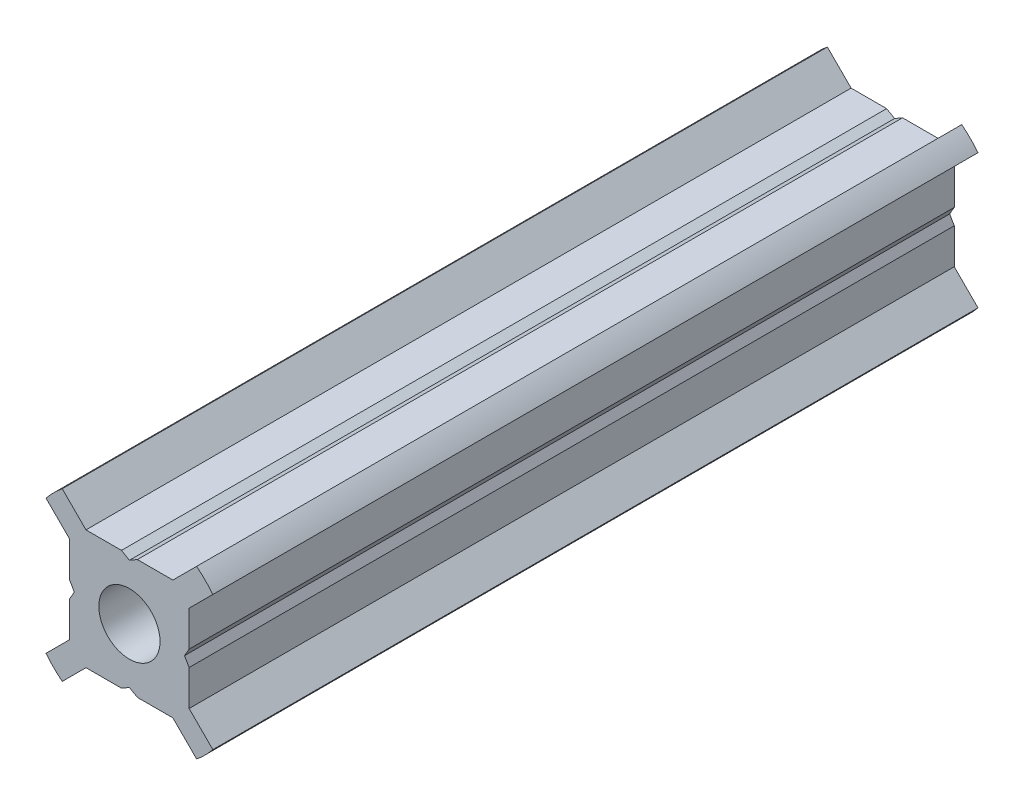
ISO-10303-21;
HEADER;
FILE_DESCRIPTION(('STEP AP214'),'2;1');
FILE_NAME('part.step','',(''),(''),'','','');
FILE_SCHEMA(('AUTOMOTIVE_DESIGN { 1 0 10303 214 1 1 1 1 }'));
ENDSEC;
DATA;
#1=APPLICATION_CONTEXT('core data for automotive mechanical design processes');
#2=APPLICATION_PROTOCOL_DEFINITION('international standard','automotive_design',2000,#1);
#3=PRODUCT_CONTEXT('',#1,'mechanical');
#4=PRODUCT('Part','Part','',(#3));
#5=PRODUCT_RELATED_PRODUCT_CATEGORY('part','',(#4));
#6=PRODUCT_DEFINITION_FORMATION('','',#4);
#7=PRODUCT_DEFINITION_CONTEXT('part definition',#1,'design');
#8=PRODUCT_DEFINITION('design','',#6,#7);
#9=PRODUCT_DEFINITION_SHAPE('','',#8);
#10=(LENGTH_UNIT() NAMED_UNIT(*) SI_UNIT(.MILLI.,.METRE.));
#11=(NAMED_UNIT(*) PLANE_ANGLE_UNIT() SI_UNIT($,.RADIAN.));
#12=(NAMED_UNIT(*) SI_UNIT($,.STERADIAN.) SOLID_ANGLE_UNIT());
#13=UNCERTAINTY_MEASURE_WITH_UNIT(LENGTH_MEASURE(1.E-05),#10,'distance_accuracy_value','');
#14=(GEOMETRIC_REPRESENTATION_CONTEXT(3) GLOBAL_UNCERTAINTY_ASSIGNED_CONTEXT((#13)) GLOBAL_UNIT_ASSIGNED_CONTEXT((#10,
#11,#12)) REPRESENTATION_CONTEXT('',''));
#15=CARTESIAN_POINT('',(0.,0.,0.));
#16=DIRECTION('',(0.,0.,1.));
#17=DIRECTION('',(1.,0.,0.));
#18=AXIS2_PLACEMENT_3D('',#15,#16,#17);
#19=CARTESIAN_POINT('',(0.530330085889972,-0.530330085889958,50.));
#20=DIRECTION('',(0.707106781186557,-0.707106781186538,0.));
#21=DIRECTION('',(0.707106781186538,0.707106781186557,0.));
#22=AXIS2_PLACEMENT_3D('',#19,#20,#21);
#23=PLANE('',#22);
#24=DIRECTION('',(-0.707106781186538,-0.707106781186557,0.));
#25=VECTOR('',#24,1.);
#26=CARTESIAN_POINT('',(0.530330085889972,-0.530330085889958,0.));
#27=LINE('',#26,#25);
#28=CARTESIAN_POINT('',(5.45158500714728,4.39092483536748,0.));
#29=VERTEX_POINT('',#28);
#30=CARTESIAN_POINT('',(3.89999999999985,2.83933982822001,0.));
#31=VERTEX_POINT('',#30);
#32=EDGE_CURVE('E270',#29,#31,#27,.T.);
#33=ORIENTED_EDGE('',*,*,#32,.F.);
#34=DIRECTION('',(0.,0.,-1.));
#35=VECTOR('',#34,1.);
#36=CARTESIAN_POINT('',(5.45158500714728,4.39092483536748,50.));
#37=LINE('',#36,#35);
#38=CARTESIAN_POINT('',(5.45158500714728,4.39092483536748,50.));
#39=VERTEX_POINT('',#38);
#40=EDGE_CURVE('E11',#39,#29,#37,.T.);
#41=ORIENTED_EDGE('',*,*,#40,.F.);
#42=DIRECTION('',(-0.707106781186538,-0.707106781186557,0.));
#43=VECTOR('',#42,1.);
#44=CARTESIAN_POINT('',(0.530330085889972,-0.530330085889958,50.));
#45=LINE('',#44,#43);
#46=CARTESIAN_POINT('',(3.89999999999985,2.83933982822001,50.));
#47=VERTEX_POINT('',#46);
#48=EDGE_CURVE('E571',#39,#47,#45,.T.);
#49=ORIENTED_EDGE('',*,*,#48,.T.);
#50=DIRECTION('',(0.,0.,-1.));
#51=VECTOR('',#50,1.);
#52=CARTESIAN_POINT('',(3.89999999999985,2.83933982822001,50.));
#53=LINE('',#52,#51);
#54=EDGE_CURVE('E159',#47,#31,#53,.T.);
#55=ORIENTED_EDGE('',*,*,#54,.T.);
#56=EDGE_LOOP('',(#33,#41,#49,#55));
#57=FACE_BOUND('',#56,.T.);
#58=ADVANCED_FACE('F47',(#57),#23,.T.);
#59=CARTESIAN_POINT('',(0.,0.,50.));
#60=DIRECTION('',(0.,0.,-1.));
#61=DIRECTION('',(-1.,0.,0.));
#62=AXIS2_PLACEMENT_3D('',#59,#60,#61);
#63=CYLINDRICAL_SURFACE('',#62,7.);
#64=CARTESIAN_POINT('',(0.,0.,0.));
#65=DIRECTION('',(0.,0.,1.));
#66=DIRECTION('',(1.,0.,0.));
#67=AXIS2_PLACEMENT_3D('',#64,#65,#66);
#68=CIRCLE('',#67,7.);
#69=CARTESIAN_POINT('',(4.39092483536735,5.45158500714739,0.));
#70=VERTEX_POINT('',#69);
#71=EDGE_CURVE('E274',#29,#70,#68,.T.);
#72=ORIENTED_EDGE('',*,*,#71,.T.);
#73=DIRECTION('',(0.,0.,-1.));
#74=VECTOR('',#73,1.);
#75=CARTESIAN_POINT('',(4.39092483536735,5.45158500714739,50.));
#76=LINE('',#75,#74);
#77=CARTESIAN_POINT('',(4.39092483536735,5.45158500714739,50.));
#78=VERTEX_POINT('',#77);
#79=EDGE_CURVE('E57',#78,#70,#76,.T.);
#80=ORIENTED_EDGE('',*,*,#79,.F.);
#81=CARTESIAN_POINT('',(0.,0.,50.));
#82=DIRECTION('',(0.,0.,1.));
#83=DIRECTION('',(1.,0.,0.));
#84=AXIS2_PLACEMENT_3D('',#81,#82,#83);
#85=CIRCLE('',#84,7.);
#86=EDGE_CURVE('E574',#39,#78,#85,.T.);
#87=ORIENTED_EDGE('',*,*,#86,.F.);
#88=ORIENTED_EDGE('',*,*,#40,.T.);
#89=EDGE_LOOP('',(#72,#80,#87,#88));
#90=FACE_BOUND('',#89,.T.);
#91=ADVANCED_FACE('F461',(#90),#63,.T.);
#92=CARTESIAN_POINT('',(-0.530330085890019,0.530330085890019,50.));
#93=DIRECTION('',(0.707106781186547,-0.707106781186548,0.));
#94=DIRECTION('',(0.707106781186548,0.707106781186547,0.));
#95=AXIS2_PLACEMENT_3D('',#92,#93,#94);
#96=PLANE('',#95);
#97=DIRECTION('',(-0.707106781186548,-0.707106781186547,0.));
#98=VECTOR('',#97,1.);
#99=CARTESIAN_POINT('',(-0.530330085890019,0.530330085890019,0.));
#100=LINE('',#99,#98);
#101=CARTESIAN_POINT('',(2.83933982821991,3.89999999999995,0.));
#102=VERTEX_POINT('',#101);
#103=EDGE_CURVE('E278',#70,#102,#100,.T.);
#104=ORIENTED_EDGE('',*,*,#103,.T.);
#105=DIRECTION('',(0.,0.,-1.));
#106=VECTOR('',#105,1.);
#107=CARTESIAN_POINT('',(2.83933982821991,3.89999999999995,50.));
#108=LINE('',#107,#106);
#109=CARTESIAN_POINT('',(2.83933982821991,3.89999999999995,50.));
#110=VERTEX_POINT('',#109);
#111=EDGE_CURVE('E447',#110,#102,#108,.T.);
#112=ORIENTED_EDGE('',*,*,#111,.F.);
#113=DIRECTION('',(-0.707106781186548,-0.707106781186547,0.));
#114=VECTOR('',#113,1.);
#115=CARTESIAN_POINT('',(-0.530330085890019,0.530330085890019,50.));
#116=LINE('',#115,#114);
#117=EDGE_CURVE('E457',#78,#110,#116,.T.);
#118=ORIENTED_EDGE('',*,*,#117,.F.);
#119=ORIENTED_EDGE('',*,*,#79,.T.);
#120=EDGE_LOOP('',(#104,#112,#118,#119));
#121=FACE_BOUND('',#120,.T.);
#122=ADVANCED_FACE('F454',(#121),#96,.F.);
#123=CARTESIAN_POINT('',(0.,3.89999999999995,50.));
#124=DIRECTION('',(0.,-1.,0.));
#125=DIRECTION('',(0.,0.,-1.));
#126=AXIS2_PLACEMENT_3D('',#123,#124,#125);
#127=PLANE('',#126);
#128=DIRECTION('',(-1.,0.,0.));
#129=VECTOR('',#128,1.);
#130=CARTESIAN_POINT('',(0.,3.89999999999995,0.));
#131=LINE('',#130,#129);
#132=CARTESIAN_POINT('',(0.519615242270402,3.89999999999995,0.));
#133=VERTEX_POINT('',#132);
#134=EDGE_CURVE('E284',#102,#133,#131,.T.);
#135=ORIENTED_EDGE('',*,*,#134,.T.);
#136=DIRECTION('',(0.,0.,-1.));
#137=VECTOR('',#136,1.);
#138=CARTESIAN_POINT('',(0.519615242270402,3.89999999999995,50.));
#139=LINE('',#138,#137);
#140=CARTESIAN_POINT('',(0.519615242270402,3.89999999999995,50.));
#141=VERTEX_POINT('',#140);
#142=EDGE_CURVE('E443',#141,#133,#139,.T.);
#143=ORIENTED_EDGE('',*,*,#142,.F.);
#144=DIRECTION('',(-1.,0.,0.));
#145=VECTOR('',#144,1.);
#146=CARTESIAN_POINT('',(0.,3.89999999999995,50.));
#147=LINE('',#146,#145);
#148=EDGE_CURVE('E583',#110,#141,#147,.T.);
#149=ORIENTED_EDGE('',*,*,#148,.F.);
#150=ORIENTED_EDGE('',*,*,#111,.T.);
#151=EDGE_LOOP('',(#135,#143,#149,#150));
#152=FACE_BOUND('',#151,.T.);
#153=ADVANCED_FACE('F474',(#152),#127,.F.);
#154=CARTESIAN_POINT('',(-1.55884572681257,2.69999999999878,50.));
#155=DIRECTION('',(0.500000000000309,-0.86602540378426,0.));
#156=DIRECTION('',(0.866025403784261,0.500000000000309,0.));
#157=AXIS2_PLACEMENT_3D('',#154,#155,#156);
#158=PLANE('',#157);
#159=DIRECTION('',(-0.866025403784261,-0.500000000000309,0.));
#160=VECTOR('',#159,1.);
#161=CARTESIAN_POINT('',(-1.55884572681257,2.69999999999878,0.));
#162=LINE('',#161,#160);
#163=CARTESIAN_POINT('',(0.,3.59999999999985,0.));
#164=VERTEX_POINT('',#163);
#165=EDGE_CURVE('E288',#133,#164,#162,.T.);
#166=ORIENTED_EDGE('',*,*,#165,.T.);
#167=DIRECTION('',(0.,0.,-1.));
#168=VECTOR('',#167,1.);
#169=CARTESIAN_POINT('',(0.,3.59999999999985,50.));
#170=LINE('',#169,#168);
#171=CARTESIAN_POINT('',(0.,3.59999999999985,50.));
#172=VERTEX_POINT('',#171);
#173=EDGE_CURVE('E440',#172,#164,#170,.T.);
#174=ORIENTED_EDGE('',*,*,#173,.F.);
#175=DIRECTION('',(-0.866025403784261,-0.500000000000309,0.));
#176=VECTOR('',#175,1.);
#177=CARTESIAN_POINT('',(-1.55884572681257,2.69999999999878,50.));
#178=LINE('',#177,#176);
#179=EDGE_CURVE('E587',#141,#172,#178,.T.);
#180=ORIENTED_EDGE('',*,*,#179,.F.);
#181=ORIENTED_EDGE('',*,*,#142,.T.);
#182=EDGE_LOOP('',(#166,#174,#180,#181));
#183=FACE_BOUND('',#182,.T.);
#184=ADVANCED_FACE('F477',(#183),#158,.F.);
#185=CARTESIAN_POINT('',(1.55884572681257,2.69999999999878,50.));
#186=DIRECTION('',(0.500000000000309,0.86602540378426,0.));
#187=DIRECTION('',(-0.866025403784261,0.500000000000309,0.));
#188=AXIS2_PLACEMENT_3D('',#185,#186,#187);
#189=PLANE('',#188);
#190=DIRECTION('',(0.866025403784261,-0.500000000000309,0.));
#191=VECTOR('',#190,1.);
#192=CARTESIAN_POINT('',(1.55884572681257,2.69999999999878,0.));
#193=LINE('',#192,#191);
#194=CARTESIAN_POINT('',(-0.519615242270402,3.89999999999995,0.));
#195=VERTEX_POINT('',#194);
#196=EDGE_CURVE('E292',#195,#164,#193,.T.);
#197=ORIENTED_EDGE('',*,*,#196,.F.);
#198=DIRECTION('',(0.,0.,-1.));
#199=VECTOR('',#198,1.);
#200=CARTESIAN_POINT('',(-0.519615242270402,3.89999999999995,50.));
#201=LINE('',#200,#199);
#202=CARTESIAN_POINT('',(-0.519615242270402,3.89999999999995,50.));
#203=VERTEX_POINT('',#202);
#204=EDGE_CURVE('E437',#203,#195,#201,.T.);
#205=ORIENTED_EDGE('',*,*,#204,.F.);
#206=DIRECTION('',(0.866025403784261,-0.500000000000309,0.));
#207=VECTOR('',#206,1.);
#208=CARTESIAN_POINT('',(1.55884572681257,2.69999999999878,50.));
#209=LINE('',#208,#207);
#210=EDGE_CURVE('E590',#203,#172,#209,.T.);
#211=ORIENTED_EDGE('',*,*,#210,.T.);
#212=ORIENTED_EDGE('',*,*,#173,.T.);
#213=EDGE_LOOP('',(#197,#205,#211,#212));
#214=FACE_BOUND('',#213,.T.);
#215=ADVANCED_FACE('F481',(#214),#189,.T.);
#216=CARTESIAN_POINT('',(0.,3.89999999999995,50.));
#217=DIRECTION('',(0.,1.,0.));
#218=DIRECTION('',(0.,0.,1.));
#219=AXIS2_PLACEMENT_3D('',#216,#217,#218);
#220=PLANE('',#219);
#221=DIRECTION('',(1.,0.,0.));
#222=VECTOR('',#221,1.);
#223=CARTESIAN_POINT('',(0.,3.89999999999995,0.));
#224=LINE('',#223,#222);
#225=CARTESIAN_POINT('',(-2.83933982821991,3.89999999999995,0.));
#226=VERTEX_POINT('',#225);
#227=EDGE_CURVE('E296',#226,#195,#224,.T.);
#228=ORIENTED_EDGE('',*,*,#227,.F.);
#229=DIRECTION('',(0.,0.,-1.));
#230=VECTOR('',#229,1.);
#231=CARTESIAN_POINT('',(-2.83933982821991,3.89999999999995,50.));
#232=LINE('',#231,#230);
#233=CARTESIAN_POINT('',(-2.83933982821991,3.89999999999995,50.));
#234=VERTEX_POINT('',#233);
#235=EDGE_CURVE('E434',#234,#226,#232,.T.);
#236=ORIENTED_EDGE('',*,*,#235,.F.);
#237=DIRECTION('',(1.,0.,0.));
#238=VECTOR('',#237,1.);
#239=CARTESIAN_POINT('',(0.,3.89999999999995,50.));
#240=LINE('',#239,#238);
#241=EDGE_CURVE('E594',#234,#203,#240,.T.);
#242=ORIENTED_EDGE('',*,*,#241,.T.);
#243=ORIENTED_EDGE('',*,*,#204,.T.);
#244=EDGE_LOOP('',(#228,#236,#242,#243));
#245=FACE_BOUND('',#244,.T.);
#246=ADVANCED_FACE('F485',(#245),#220,.T.);
#247=CARTESIAN_POINT('',(0.530330085890019,0.530330085890019,50.));
#248=DIRECTION('',(0.707106781186547,0.707106781186548,0.));
#249=DIRECTION('',(-0.707106781186548,0.707106781186547,0.));
#250=AXIS2_PLACEMENT_3D('',#247,#248,#249);
#251=PLANE('',#250);
#252=DIRECTION('',(0.707106781186548,-0.707106781186547,0.));
#253=VECTOR('',#252,1.);
#254=CARTESIAN_POINT('',(0.530330085890019,0.530330085890019,0.));
#255=LINE('',#254,#253);
#256=CARTESIAN_POINT('',(-4.39092483536735,5.45158500714739,0.));
#257=VERTEX_POINT('',#256);
#258=EDGE_CURVE('E300',#257,#226,#255,.T.);
#259=ORIENTED_EDGE('',*,*,#258,.F.);
#260=DIRECTION('',(0.,0.,-1.));
#261=VECTOR('',#260,1.);
#262=CARTESIAN_POINT('',(-4.39092483536735,5.45158500714739,50.));
#263=LINE('',#262,#261);
#264=CARTESIAN_POINT('',(-4.39092483536735,5.45158500714739,50.));
#265=VERTEX_POINT('',#264);
#266=EDGE_CURVE('E431',#265,#257,#263,.T.);
#267=ORIENTED_EDGE('',*,*,#266,.F.);
#268=DIRECTION('',(0.707106781186548,-0.707106781186547,0.));
#269=VECTOR('',#268,1.);
#270=CARTESIAN_POINT('',(0.530330085890019,0.530330085890019,50.));
#271=LINE('',#270,#269);
#272=EDGE_CURVE('E598',#265,#234,#271,.T.);
#273=ORIENTED_EDGE('',*,*,#272,.T.);
#274=ORIENTED_EDGE('',*,*,#235,.T.);
#275=EDGE_LOOP('',(#259,#267,#273,#274));
#276=FACE_BOUND('',#275,.T.);
#277=ADVANCED_FACE('F489',(#276),#251,.T.);
#278=CARTESIAN_POINT('',(-5.4515850071473,4.39092483536746,0.));
#279=VERTEX_POINT('',#278);
#280=EDGE_CURVE('E280',#257,#279,#68,.T.);
#281=ORIENTED_EDGE('',*,*,#280,.T.);
#282=DIRECTION('',(0.,0.,-1.));
#283=VECTOR('',#282,1.);
#284=CARTESIAN_POINT('',(-5.4515850071473,4.39092483536746,50.));
#285=LINE('',#284,#283);
#286=CARTESIAN_POINT('',(-5.4515850071473,4.39092483536746,50.));
#287=VERTEX_POINT('',#286);
#288=EDGE_CURVE('E427',#287,#279,#285,.T.);
#289=ORIENTED_EDGE('',*,*,#288,.F.);
#290=EDGE_CURVE('E580',#265,#287,#85,.T.);
#291=ORIENTED_EDGE('',*,*,#290,.F.);
#292=ORIENTED_EDGE('',*,*,#266,.T.);
#293=EDGE_LOOP('',(#281,#289,#291,#292));
#294=FACE_BOUND('',#293,.T.);
#295=ADVANCED_FACE('F469',(#294),#63,.T.);
#296=CARTESIAN_POINT('',(-0.530330085889926,-0.530330085889924,50.));
#297=DIRECTION('',(0.707106781186549,0.707106781186546,0.));
#298=DIRECTION('',(-0.707106781186546,0.707106781186549,0.));
#299=AXIS2_PLACEMENT_3D('',#296,#297,#298);
#300=PLANE('',#299);
#301=DIRECTION('',(0.707106781186546,-0.707106781186549,0.));
#302=VECTOR('',#301,1.);
#303=CARTESIAN_POINT('',(-0.530330085889926,-0.530330085889924,0.));
#304=LINE('',#303,#302);
#305=CARTESIAN_POINT('',(-3.89999999999985,2.83933982822001,0.));
#306=VERTEX_POINT('',#305);
#307=EDGE_CURVE('E304',#279,#306,#304,.T.);
#308=ORIENTED_EDGE('',*,*,#307,.T.);
#309=DIRECTION('',(0.,0.,-1.));
#310=VECTOR('',#309,1.);
#311=CARTESIAN_POINT('',(-3.89999999999985,2.83933982822001,50.));
#312=LINE('',#311,#310);
#313=CARTESIAN_POINT('',(-3.89999999999985,2.83933982822001,50.));
#314=VERTEX_POINT('',#313);
#315=EDGE_CURVE('E424',#314,#306,#312,.T.);
#316=ORIENTED_EDGE('',*,*,#315,.F.);
#317=DIRECTION('',(0.707106781186546,-0.707106781186549,0.));
#318=VECTOR('',#317,1.);
#319=CARTESIAN_POINT('',(-0.530330085889926,-0.530330085889924,50.));
#320=LINE('',#319,#318);
#321=EDGE_CURVE('E602',#287,#314,#320,.T.);
#322=ORIENTED_EDGE('',*,*,#321,.F.);
#323=ORIENTED_EDGE('',*,*,#288,.T.);
#324=EDGE_LOOP('',(#308,#316,#322,#323));
#325=FACE_BOUND('',#324,.T.);
#326=ADVANCED_FACE('F494',(#325),#300,.F.);
#327=CARTESIAN_POINT('',(-3.89999999999986,0.,50.));
#328=DIRECTION('',(-1.,0.,0.));
#329=DIRECTION('',(0.,-1.,0.));
#330=AXIS2_PLACEMENT_3D('',#327,#328,#329);
#331=PLANE('',#330);
#332=DIRECTION('',(0.,1.,0.));
#333=VECTOR('',#332,1.);
#334=CARTESIAN_POINT('',(-3.89999999999986,0.,0.));
#335=LINE('',#334,#333);
#336=CARTESIAN_POINT('',(-3.89999999999986,0.519615242270506,0.));
#337=VERTEX_POINT('',#336);
#338=EDGE_CURVE('E308',#337,#306,#335,.T.);
#339=ORIENTED_EDGE('',*,*,#338,.F.);
#340=DIRECTION('',(0.,0.,-1.));
#341=VECTOR('',#340,1.);
#342=CARTESIAN_POINT('',(-3.89999999999986,0.519615242270506,50.));
#343=LINE('',#342,#341);
#344=CARTESIAN_POINT('',(-3.89999999999986,0.519615242270506,50.));
#345=VERTEX_POINT('',#344);
#346=EDGE_CURVE('E421',#345,#337,#343,.T.);
#347=ORIENTED_EDGE('',*,*,#346,.F.);
#348=DIRECTION('',(0.,1.,0.));
#349=VECTOR('',#348,1.);
#350=CARTESIAN_POINT('',(-3.89999999999986,0.,50.));
#351=LINE('',#350,#349);
#352=EDGE_CURVE('E605',#345,#314,#351,.T.);
#353=ORIENTED_EDGE('',*,*,#352,.T.);
#354=ORIENTED_EDGE('',*,*,#315,.T.);
#355=EDGE_LOOP('',(#339,#347,#353,#354));
#356=FACE_BOUND('',#355,.T.);
#357=ADVANCED_FACE('F497',(#356),#331,.T.);
#358=CARTESIAN_POINT('',(-2.69999999999997,-1.55884572681197,50.));
#359=DIRECTION('',(0.866025403784439,0.499999999999999,0.));
#360=DIRECTION('',(-0.499999999999999,0.866025403784439,0.));
#361=AXIS2_PLACEMENT_3D('',#358,#359,#360);
#362=PLANE('',#361);
#363=DIRECTION('',(0.499999999999999,-0.866025403784439,0.));
#364=VECTOR('',#363,1.);
#365=CARTESIAN_POINT('',(-2.69999999999997,-1.55884572681197,0.));
#366=LINE('',#365,#364);
#367=CARTESIAN_POINT('',(-3.59999999999986,-1.60895602396849E-13,0.));
#368=VERTEX_POINT('',#367);
#369=EDGE_CURVE('E312',#337,#368,#366,.T.);
#370=ORIENTED_EDGE('',*,*,#369,.T.);
#371=DIRECTION('',(0.,0.,-1.));
#372=VECTOR('',#371,1.);
#373=CARTESIAN_POINT('',(-3.59999999999986,-1.60895602396849E-13,50.));
#374=LINE('',#373,#372);
#375=CARTESIAN_POINT('',(-3.59999999999986,-1.60895602396849E-13,50.));
#376=VERTEX_POINT('',#375);
#377=EDGE_CURVE('E417',#376,#368,#374,.T.);
#378=ORIENTED_EDGE('',*,*,#377,.F.);
#379=DIRECTION('',(0.499999999999999,-0.866025403784439,0.));
#380=VECTOR('',#379,1.);
#381=CARTESIAN_POINT('',(-2.69999999999997,-1.55884572681197,50.));
#382=LINE('',#381,#380);
#383=EDGE_CURVE('E609',#345,#376,#382,.T.);
#384=ORIENTED_EDGE('',*,*,#383,.F.);
#385=ORIENTED_EDGE('',*,*,#346,.T.);
#386=EDGE_LOOP('',(#370,#378,#384,#385));
#387=FACE_BOUND('',#386,.T.);
#388=ADVANCED_FACE('F501',(#387),#362,.F.);
#389=CARTESIAN_POINT('',(-2.69999999999899,1.55884572681237,50.));
#390=DIRECTION('',(0.866025403784305,-0.500000000000231,0.));
#391=DIRECTION('',(0.500000000000231,0.866025403784305,0.));
#392=AXIS2_PLACEMENT_3D('',#389,#390,#391);
#393=PLANE('',#392);
#394=DIRECTION('',(-0.500000000000231,-0.866025403784305,0.));
#395=VECTOR('',#394,1.);
#396=CARTESIAN_POINT('',(-2.69999999999899,1.55884572681237,0.));
#397=LINE('',#396,#395);
#398=CARTESIAN_POINT('',(-3.89999999999986,-0.519615242270506,0.));
#399=VERTEX_POINT('',#398);
#400=EDGE_CURVE('E316',#368,#399,#397,.T.);
#401=ORIENTED_EDGE('',*,*,#400,.T.);
#402=DIRECTION('',(0.,0.,-1.));
#403=VECTOR('',#402,1.);
#404=CARTESIAN_POINT('',(-3.89999999999986,-0.519615242270506,50.));
#405=LINE('',#404,#403);
#406=CARTESIAN_POINT('',(-3.89999999999986,-0.519615242270506,50.));
#407=VERTEX_POINT('',#406);
#408=EDGE_CURVE('E414',#407,#399,#405,.T.);
#409=ORIENTED_EDGE('',*,*,#408,.F.);
#410=DIRECTION('',(-0.500000000000231,-0.866025403784305,0.));
#411=VECTOR('',#410,1.);
#412=CARTESIAN_POINT('',(-2.69999999999899,1.55884572681237,50.));
#413=LINE('',#412,#411);
#414=EDGE_CURVE('E613',#376,#407,#413,.T.);
#415=ORIENTED_EDGE('',*,*,#414,.F.);
#416=ORIENTED_EDGE('',*,*,#377,.T.);
#417=EDGE_LOOP('',(#401,#409,#415,#416));
#418=FACE_BOUND('',#417,.T.);
#419=ADVANCED_FACE('F505',(#418),#393,.F.);
#420=CARTESIAN_POINT('',(-3.89999999999986,0.,50.));
#421=DIRECTION('',(-1.,0.,0.));
#422=DIRECTION('',(0.,-1.,0.));
#423=AXIS2_PLACEMENT_3D('',#420,#421,#422);
#424=PLANE('',#423);
#425=DIRECTION('',(0.,1.,0.));
#426=VECTOR('',#425,1.);
#427=CARTESIAN_POINT('',(-3.89999999999986,0.,0.));
#428=LINE('',#427,#426);
#429=CARTESIAN_POINT('',(-3.89999999999985,-2.83933982822001,0.));
#430=VERTEX_POINT('',#429);
#431=EDGE_CURVE('E320',#430,#399,#428,.T.);
#432=ORIENTED_EDGE('',*,*,#431,.F.);
#433=DIRECTION('',(0.,0.,-1.));
#434=VECTOR('',#433,1.);
#435=CARTESIAN_POINT('',(-3.89999999999985,-2.83933982822001,50.));
#436=LINE('',#435,#434);
#437=CARTESIAN_POINT('',(-3.89999999999985,-2.83933982822001,50.));
#438=VERTEX_POINT('',#437);
#439=EDGE_CURVE('E411',#438,#430,#436,.T.);
#440=ORIENTED_EDGE('',*,*,#439,.F.);
#441=DIRECTION('',(0.,1.,0.));
#442=VECTOR('',#441,1.);
#443=CARTESIAN_POINT('',(-3.89999999999986,0.,50.));
#444=LINE('',#443,#442);
#445=EDGE_CURVE('E616',#438,#407,#444,.T.);
#446=ORIENTED_EDGE('',*,*,#445,.T.);
#447=ORIENTED_EDGE('',*,*,#408,.T.);
#448=EDGE_LOOP('',(#432,#440,#446,#447));
#449=FACE_BOUND('',#448,.T.);
#450=ADVANCED_FACE('F509',(#449),#424,.T.);
#451=CARTESIAN_POINT('',(-0.530330085889926,0.530330085889924,50.));
#452=DIRECTION('',(-0.707106781186549,0.707106781186546,0.));
#453=DIRECTION('',(-0.707106781186546,-0.707106781186549,0.));
#454=AXIS2_PLACEMENT_3D('',#451,#452,#453);
#455=PLANE('',#454);
#456=DIRECTION('',(0.707106781186546,0.707106781186549,0.));
#457=VECTOR('',#456,1.);
#458=CARTESIAN_POINT('',(-0.530330085889926,0.530330085889924,0.));
#459=LINE('',#458,#457);
#460=CARTESIAN_POINT('',(-5.4515850071473,-4.39092483536746,0.));
#461=VERTEX_POINT('',#460);
#462=EDGE_CURVE('E324',#461,#430,#459,.T.);
#463=ORIENTED_EDGE('',*,*,#462,.F.);
#464=DIRECTION('',(0.,0.,-1.));
#465=VECTOR('',#464,1.);
#466=CARTESIAN_POINT('',(-5.4515850071473,-4.39092483536746,50.));
#467=LINE('',#466,#465);
#468=CARTESIAN_POINT('',(-5.4515850071473,-4.39092483536746,50.));
#469=VERTEX_POINT('',#468);
#470=EDGE_CURVE('E408',#469,#461,#467,.T.);
#471=ORIENTED_EDGE('',*,*,#470,.F.);
#472=DIRECTION('',(0.707106781186546,0.707106781186549,0.));
#473=VECTOR('',#472,1.);
#474=CARTESIAN_POINT('',(-0.530330085889926,0.530330085889924,50.));
#475=LINE('',#474,#473);
#476=EDGE_CURVE('E620',#469,#438,#475,.T.);
#477=ORIENTED_EDGE('',*,*,#476,.T.);
#478=ORIENTED_EDGE('',*,*,#439,.T.);
#479=EDGE_LOOP('',(#463,#471,#477,#478));
#480=FACE_BOUND('',#479,.T.);
#481=ADVANCED_FACE('F513',(#480),#455,.T.);
#482=CARTESIAN_POINT('',(-4.39092483536735,-5.45158500714739,0.));
#483=VERTEX_POINT('',#482);
#484=EDGE_CURVE('E328',#461,#483,#68,.T.);
#485=ORIENTED_EDGE('',*,*,#484,.T.);
#486=DIRECTION('',(0.,0.,-1.));
#487=VECTOR('',#486,1.);
#488=CARTESIAN_POINT('',(-4.39092483536735,-5.45158500714739,50.));
#489=LINE('',#488,#487);
#490=CARTESIAN_POINT('',(-4.39092483536735,-5.45158500714739,50.));
#491=VERTEX_POINT('',#490);
#492=EDGE_CURVE('E404',#491,#483,#489,.T.);
#493=ORIENTED_EDGE('',*,*,#492,.F.);
#494=EDGE_CURVE('E624',#469,#491,#85,.T.);
#495=ORIENTED_EDGE('',*,*,#494,.F.);
#496=ORIENTED_EDGE('',*,*,#470,.T.);
#497=EDGE_LOOP('',(#485,#493,#495,#496));
#498=FACE_BOUND('',#497,.T.);
#499=ADVANCED_FACE('F517',(#498),#63,.T.);
#500=CARTESIAN_POINT('',(0.530330085890019,-0.530330085890019,50.));
#501=DIRECTION('',(-0.707106781186548,0.707106781186547,0.));
#502=DIRECTION('',(-0.707106781186547,-0.707106781186548,0.));
#503=AXIS2_PLACEMENT_3D('',#500,#501,#502);
#504=PLANE('',#503);
#505=DIRECTION('',(0.707106781186547,0.707106781186548,0.));
#506=VECTOR('',#505,1.);
#507=CARTESIAN_POINT('',(0.530330085890019,-0.530330085890019,0.));
#508=LINE('',#507,#506);
#509=CARTESIAN_POINT('',(-2.83933982821991,-3.89999999999995,0.));
#510=VERTEX_POINT('',#509);
#511=EDGE_CURVE('E329',#483,#510,#508,.T.);
#512=ORIENTED_EDGE('',*,*,#511,.T.);
#513=DIRECTION('',(0.,0.,-1.));
#514=VECTOR('',#513,1.);
#515=CARTESIAN_POINT('',(-2.83933982821991,-3.89999999999995,50.));
#516=LINE('',#515,#514);
#517=CARTESIAN_POINT('',(-2.83933982821991,-3.89999999999995,50.));
#518=VERTEX_POINT('',#517);
#519=EDGE_CURVE('E400',#518,#510,#516,.T.);
#520=ORIENTED_EDGE('',*,*,#519,.F.);
#521=DIRECTION('',(0.707106781186547,0.707106781186548,0.));
#522=VECTOR('',#521,1.);
#523=CARTESIAN_POINT('',(0.530330085890019,-0.530330085890019,50.));
#524=LINE('',#523,#522);
#525=EDGE_CURVE('E625',#491,#518,#524,.T.);
#526=ORIENTED_EDGE('',*,*,#525,.F.);
#527=ORIENTED_EDGE('',*,*,#492,.T.);
#528=EDGE_LOOP('',(#512,#520,#526,#527));
#529=FACE_BOUND('',#528,.T.);
#530=ADVANCED_FACE('F519',(#529),#504,.F.);
#531=CARTESIAN_POINT('',(0.,-3.89999999999995,50.));
#532=DIRECTION('',(0.,1.,0.));
#533=DIRECTION('',(0.,0.,1.));
#534=AXIS2_PLACEMENT_3D('',#531,#532,#533);
#535=PLANE('',#534);
#536=DIRECTION('',(1.,0.,0.));
#537=VECTOR('',#536,1.);
#538=CARTESIAN_POINT('',(0.,-3.89999999999995,0.));
#539=LINE('',#538,#537);
#540=CARTESIAN_POINT('',(-0.519615242270402,-3.89999999999995,0.));
#541=VERTEX_POINT('',#540);
#542=EDGE_CURVE('E333',#510,#541,#539,.T.);
#543=ORIENTED_EDGE('',*,*,#542,.T.);
#544=DIRECTION('',(0.,0.,-1.));
#545=VECTOR('',#544,1.);
#546=CARTESIAN_POINT('',(-0.519615242270402,-3.89999999999995,50.));
#547=LINE('',#546,#545);
#548=CARTESIAN_POINT('',(-0.519615242270402,-3.89999999999995,50.));
#549=VERTEX_POINT('',#548);
#550=EDGE_CURVE('E396',#549,#541,#547,.T.);
#551=ORIENTED_EDGE('',*,*,#550,.F.);
#552=DIRECTION('',(1.,0.,0.));
#553=VECTOR('',#552,1.);
#554=CARTESIAN_POINT('',(0.,-3.89999999999995,50.));
#555=LINE('',#554,#553);
#556=EDGE_CURVE('E629',#518,#549,#555,.T.);
#557=ORIENTED_EDGE('',*,*,#556,.F.);
#558=ORIENTED_EDGE('',*,*,#519,.T.);
#559=EDGE_LOOP('',(#543,#551,#557,#558));
#560=FACE_BOUND('',#559,.T.);
#561=ADVANCED_FACE('F522',(#560),#535,.F.);
#562=CARTESIAN_POINT('',(1.55884572681275,-2.69999999999833,50.));
#563=DIRECTION('',(-0.500000000000415,0.866025403784199,0.));
#564=DIRECTION('',(-0.866025403784199,-0.500000000000415,0.));
#565=AXIS2_PLACEMENT_3D('',#562,#563,#564);
#566=PLANE('',#565);
#567=DIRECTION('',(0.866025403784199,0.500000000000415,0.));
#568=VECTOR('',#567,1.);
#569=CARTESIAN_POINT('',(1.55884572681275,-2.69999999999833,0.));
#570=LINE('',#569,#568);
#571=CARTESIAN_POINT('',(0.,-3.59999999999977,0.));
#572=VERTEX_POINT('',#571);
#573=EDGE_CURVE('E337',#541,#572,#570,.T.);
#574=ORIENTED_EDGE('',*,*,#573,.T.);
#575=DIRECTION('',(0.,0.,-1.));
#576=VECTOR('',#575,1.);
#577=CARTESIAN_POINT('',(0.,-3.59999999999977,50.));
#578=LINE('',#577,#576);
#579=CARTESIAN_POINT('',(0.,-3.59999999999977,50.));
#580=VERTEX_POINT('',#579);
#581=EDGE_CURVE('E393',#580,#572,#578,.T.);
#582=ORIENTED_EDGE('',*,*,#581,.F.);
#583=DIRECTION('',(0.866025403784199,0.500000000000415,0.));
#584=VECTOR('',#583,1.);
#585=CARTESIAN_POINT('',(1.55884572681275,-2.69999999999833,50.));
#586=LINE('',#585,#584);
#587=EDGE_CURVE('E633',#549,#580,#586,.T.);
#588=ORIENTED_EDGE('',*,*,#587,.F.);
#589=ORIENTED_EDGE('',*,*,#550,.T.);
#590=EDGE_LOOP('',(#574,#582,#588,#589));
#591=FACE_BOUND('',#590,.T.);
#592=ADVANCED_FACE('F526',(#591),#566,.F.);
#593=CARTESIAN_POINT('',(-1.55884572681275,-2.69999999999833,50.));
#594=DIRECTION('',(-0.500000000000415,-0.866025403784199,0.));
#595=DIRECTION('',(0.866025403784199,-0.500000000000415,0.));
#596=AXIS2_PLACEMENT_3D('',#593,#594,#595);
#597=PLANE('',#596);
#598=DIRECTION('',(-0.866025403784199,0.500000000000415,0.));
#599=VECTOR('',#598,1.);
#600=CARTESIAN_POINT('',(-1.55884572681275,-2.69999999999833,0.));
#601=LINE('',#600,#599);
#602=CARTESIAN_POINT('',(0.519615242270402,-3.89999999999995,0.));
#603=VERTEX_POINT('',#602);
#604=EDGE_CURVE('E341',#603,#572,#601,.T.);
#605=ORIENTED_EDGE('',*,*,#604,.F.);
#606=DIRECTION('',(0.,0.,-1.));
#607=VECTOR('',#606,1.);
#608=CARTESIAN_POINT('',(0.519615242270402,-3.89999999999995,50.));
#609=LINE('',#608,#607);
#610=CARTESIAN_POINT('',(0.519615242270402,-3.89999999999995,50.));
#611=VERTEX_POINT('',#610);
#612=EDGE_CURVE('E390',#611,#603,#609,.T.);
#613=ORIENTED_EDGE('',*,*,#612,.F.);
#614=DIRECTION('',(-0.866025403784199,0.500000000000415,0.));
#615=VECTOR('',#614,1.);
#616=CARTESIAN_POINT('',(-1.55884572681275,-2.69999999999833,50.));
#617=LINE('',#616,#615);
#618=EDGE_CURVE('E636',#611,#580,#617,.T.);
#619=ORIENTED_EDGE('',*,*,#618,.T.);
#620=ORIENTED_EDGE('',*,*,#581,.T.);
#621=EDGE_LOOP('',(#605,#613,#619,#620));
#622=FACE_BOUND('',#621,.T.);
#623=ADVANCED_FACE('F530',(#622),#597,.T.);
#624=CARTESIAN_POINT('',(0.,-3.89999999999995,50.));
#625=DIRECTION('',(0.,-1.,0.));
#626=DIRECTION('',(0.,0.,-1.));
#627=AXIS2_PLACEMENT_3D('',#624,#625,#626);
#628=PLANE('',#627);
#629=DIRECTION('',(-1.,0.,0.));
#630=VECTOR('',#629,1.);
#631=CARTESIAN_POINT('',(0.,-3.89999999999995,0.));
#632=LINE('',#631,#630);
#633=CARTESIAN_POINT('',(2.83933982821991,-3.89999999999995,0.));
#634=VERTEX_POINT('',#633);
#635=EDGE_CURVE('E345',#634,#603,#632,.T.);
#636=ORIENTED_EDGE('',*,*,#635,.F.);
#637=DIRECTION('',(0.,0.,-1.));
#638=VECTOR('',#637,1.);
#639=CARTESIAN_POINT('',(2.83933982821991,-3.89999999999995,50.));
#640=LINE('',#639,#638);
#641=CARTESIAN_POINT('',(2.83933982821991,-3.89999999999995,50.));
#642=VERTEX_POINT('',#641);
#643=EDGE_CURVE('E387',#642,#634,#640,.T.);
#644=ORIENTED_EDGE('',*,*,#643,.F.);
#645=DIRECTION('',(-1.,0.,0.));
#646=VECTOR('',#645,1.);
#647=CARTESIAN_POINT('',(0.,-3.89999999999995,50.));
#648=LINE('',#647,#646);
#649=EDGE_CURVE('E640',#642,#611,#648,.T.);
#650=ORIENTED_EDGE('',*,*,#649,.T.);
#651=ORIENTED_EDGE('',*,*,#612,.T.);
#652=EDGE_LOOP('',(#636,#644,#650,#651));
#653=FACE_BOUND('',#652,.T.);
#654=ADVANCED_FACE('F534',(#653),#628,.T.);
#655=CARTESIAN_POINT('',(-0.530330085890019,-0.530330085890019,50.));
#656=DIRECTION('',(-0.707106781186548,-0.707106781186547,0.));
#657=DIRECTION('',(0.707106781186547,-0.707106781186548,0.));
#658=AXIS2_PLACEMENT_3D('',#655,#656,#657);
#659=PLANE('',#658);
#660=DIRECTION('',(-0.707106781186547,0.707106781186548,0.));
#661=VECTOR('',#660,1.);
#662=CARTESIAN_POINT('',(-0.530330085890019,-0.530330085890019,0.));
#663=LINE('',#662,#661);
#664=CARTESIAN_POINT('',(4.39092483536735,-5.45158500714739,0.));
#665=VERTEX_POINT('',#664);
#666=EDGE_CURVE('E349',#665,#634,#663,.T.);
#667=ORIENTED_EDGE('',*,*,#666,.F.);
#668=DIRECTION('',(0.,0.,-1.));
#669=VECTOR('',#668,1.);
#670=CARTESIAN_POINT('',(4.39092483536735,-5.45158500714739,50.));
#671=LINE('',#670,#669);
#672=CARTESIAN_POINT('',(4.39092483536735,-5.45158500714739,50.));
#673=VERTEX_POINT('',#672);
#674=EDGE_CURVE('E384',#673,#665,#671,.T.);
#675=ORIENTED_EDGE('',*,*,#674,.F.);
#676=DIRECTION('',(-0.707106781186547,0.707106781186548,0.));
#677=VECTOR('',#676,1.);
#678=CARTESIAN_POINT('',(-0.530330085890019,-0.530330085890019,50.));
#679=LINE('',#678,#677);
#680=EDGE_CURVE('E644',#673,#642,#679,.T.);
#681=ORIENTED_EDGE('',*,*,#680,.T.);
#682=ORIENTED_EDGE('',*,*,#643,.T.);
#683=EDGE_LOOP('',(#667,#675,#681,#682));
#684=FACE_BOUND('',#683,.T.);
#685=ADVANCED_FACE('F538',(#684),#659,.T.);
#686=CARTESIAN_POINT('',(5.45158500714729,-4.39092483536747,0.));
#687=VERTEX_POINT('',#686);
#688=EDGE_CURVE('E279',#665,#687,#68,.T.);
#689=ORIENTED_EDGE('',*,*,#688,.T.);
#690=DIRECTION('',(0.,0.,-1.));
#691=VECTOR('',#690,1.);
#692=CARTESIAN_POINT('',(5.45158500714729,-4.39092483536747,50.));
#693=LINE('',#692,#691);
#694=CARTESIAN_POINT('',(5.45158500714729,-4.39092483536747,50.));
#695=VERTEX_POINT('',#694);
#696=EDGE_CURVE('E380',#695,#687,#693,.T.);
#697=ORIENTED_EDGE('',*,*,#696,.F.);
#698=EDGE_CURVE('E579',#673,#695,#85,.T.);
#699=ORIENTED_EDGE('',*,*,#698,.F.);
#700=ORIENTED_EDGE('',*,*,#674,.T.);
#701=EDGE_LOOP('',(#689,#697,#699,#700));
#702=FACE_BOUND('',#701,.T.);
#703=ADVANCED_FACE('F470',(#702),#63,.T.);
#704=CARTESIAN_POINT('',(0.53033008588994,0.530330085889935,50.));
#705=DIRECTION('',(-0.707106781186551,-0.707106781186544,0.));
#706=DIRECTION('',(0.707106781186544,-0.707106781186551,0.));
#707=AXIS2_PLACEMENT_3D('',#704,#705,#706);
#708=PLANE('',#707);
#709=DIRECTION('',(-0.707106781186544,0.707106781186551,0.));
#710=VECTOR('',#709,1.);
#711=CARTESIAN_POINT('',(0.53033008588994,0.530330085889935,0.));
#712=LINE('',#711,#710);
#713=CARTESIAN_POINT('',(3.89999999999985,-2.83933982822001,0.));
#714=VERTEX_POINT('',#713);
#715=EDGE_CURVE('E353',#687,#714,#712,.T.);
#716=ORIENTED_EDGE('',*,*,#715,.T.);
#717=DIRECTION('',(0.,0.,-1.));
#718=VECTOR('',#717,1.);
#719=CARTESIAN_POINT('',(3.89999999999985,-2.83933982822001,50.));
#720=LINE('',#719,#718);
#721=CARTESIAN_POINT('',(3.89999999999985,-2.83933982822001,50.));
#722=VERTEX_POINT('',#721);
#723=EDGE_CURVE('E376',#722,#714,#720,.T.);
#724=ORIENTED_EDGE('',*,*,#723,.F.);
#725=DIRECTION('',(-0.707106781186544,0.707106781186551,0.));
#726=VECTOR('',#725,1.);
#727=CARTESIAN_POINT('',(0.53033008588994,0.530330085889935,50.));
#728=LINE('',#727,#726);
#729=EDGE_CURVE('E648',#695,#722,#728,.T.);
#730=ORIENTED_EDGE('',*,*,#729,.F.);
#731=ORIENTED_EDGE('',*,*,#696,.T.);
#732=EDGE_LOOP('',(#716,#724,#730,#731));
#733=FACE_BOUND('',#732,.T.);
#734=ADVANCED_FACE('F544',(#733),#708,.F.);
#735=CARTESIAN_POINT('',(3.89999999999986,0.,50.));
#736=DIRECTION('',(-1.,0.,0.));
#737=DIRECTION('',(0.,-1.,0.));
#738=AXIS2_PLACEMENT_3D('',#735,#736,#737);
#739=PLANE('',#738);
#740=DIRECTION('',(0.,1.,0.));
#741=VECTOR('',#740,1.);
#742=CARTESIAN_POINT('',(3.89999999999986,0.,0.));
#743=LINE('',#742,#741);
#744=CARTESIAN_POINT('',(3.89999999999986,-0.519615242270506,0.));
#745=VERTEX_POINT('',#744);
#746=EDGE_CURVE('E357',#714,#745,#743,.T.);
#747=ORIENTED_EDGE('',*,*,#746,.T.);
#748=DIRECTION('',(0.,0.,-1.));
#749=VECTOR('',#748,1.);
#750=CARTESIAN_POINT('',(3.89999999999986,-0.519615242270506,50.));
#751=LINE('',#750,#749);
#752=CARTESIAN_POINT('',(3.89999999999986,-0.519615242270506,50.));
#753=VERTEX_POINT('',#752);
#754=EDGE_CURVE('E250',#753,#745,#751,.T.);
#755=ORIENTED_EDGE('',*,*,#754,.F.);
#756=DIRECTION('',(0.,1.,0.));
#757=VECTOR('',#756,1.);
#758=CARTESIAN_POINT('',(3.89999999999986,0.,50.));
#759=LINE('',#758,#757);
#760=EDGE_CURVE('E255',#722,#753,#759,.T.);
#761=ORIENTED_EDGE('',*,*,#760,.F.);
#762=ORIENTED_EDGE('',*,*,#723,.T.);
#763=EDGE_LOOP('',(#747,#755,#761,#762));
#764=FACE_BOUND('',#763,.T.);
#765=ADVANCED_FACE('F548',(#764),#739,.F.);
#766=CARTESIAN_POINT('',(2.69999999999899,1.55884572681237,50.));
#767=DIRECTION('',(0.866025403784305,0.500000000000231,0.));
#768=DIRECTION('',(-0.500000000000231,0.866025403784305,0.));
#769=AXIS2_PLACEMENT_3D('',#766,#767,#768);
#770=PLANE('',#769);
#771=DIRECTION('',(0.500000000000231,-0.866025403784305,0.));
#772=VECTOR('',#771,1.);
#773=CARTESIAN_POINT('',(2.69999999999899,1.55884572681237,0.));
#774=LINE('',#773,#772);
#775=CARTESIAN_POINT('',(3.59999999999986,-1.60895602396849E-13,0.));
#776=VERTEX_POINT('',#775);
#777=EDGE_CURVE('E244',#776,#745,#774,.T.);
#778=ORIENTED_EDGE('',*,*,#777,.F.);
#779=DIRECTION('',(0.,0.,-1.));
#780=VECTOR('',#779,1.);
#781=CARTESIAN_POINT('',(3.59999999999986,-1.60895602396849E-13,50.));
#782=LINE('',#781,#780);
#783=CARTESIAN_POINT('',(3.59999999999986,-1.60895602396849E-13,50.));
#784=VERTEX_POINT('',#783);
#785=EDGE_CURVE('E239',#784,#776,#782,.T.);
#786=ORIENTED_EDGE('',*,*,#785,.F.);
#787=DIRECTION('',(0.500000000000231,-0.866025403784305,0.));
#788=VECTOR('',#787,1.);
#789=CARTESIAN_POINT('',(2.69999999999899,1.55884572681237,50.));
#790=LINE('',#789,#788);
#791=EDGE_CURVE('E242',#784,#753,#790,.T.);
#792=ORIENTED_EDGE('',*,*,#791,.T.);
#793=ORIENTED_EDGE('',*,*,#754,.T.);
#794=EDGE_LOOP('',(#778,#786,#792,#793));
#795=FACE_BOUND('',#794,.T.);
#796=ADVANCED_FACE('F241',(#795),#770,.T.);
#797=CARTESIAN_POINT('',(2.69999999999997,-1.55884572681197,50.));
#798=DIRECTION('',(0.866025403784439,-0.499999999999999,0.));
#799=DIRECTION('',(0.499999999999999,0.866025403784439,0.));
#800=AXIS2_PLACEMENT_3D('',#797,#798,#799);
#801=PLANE('',#800);
#802=DIRECTION('',(-0.499999999999999,-0.866025403784439,0.));
#803=VECTOR('',#802,1.);
#804=CARTESIAN_POINT('',(2.69999999999997,-1.55884572681197,0.));
#805=LINE('',#804,#803);
#806=CARTESIAN_POINT('',(3.89999999999986,0.519615242270506,0.));
#807=VERTEX_POINT('',#806);
#808=EDGE_CURVE('E363',#807,#776,#805,.T.);
#809=ORIENTED_EDGE('',*,*,#808,.F.);
#810=DIRECTION('',(0.,0.,-1.));
#811=VECTOR('',#810,1.);
#812=CARTESIAN_POINT('',(3.89999999999986,0.519615242270506,50.));
#813=LINE('',#812,#811);
#814=CARTESIAN_POINT('',(3.89999999999986,0.519615242270506,50.));
#815=VERTEX_POINT('',#814);
#816=EDGE_CURVE('E152',#815,#807,#813,.T.);
#817=ORIENTED_EDGE('',*,*,#816,.F.);
#818=DIRECTION('',(-0.499999999999999,-0.866025403784439,0.));
#819=VECTOR('',#818,1.);
#820=CARTESIAN_POINT('',(2.69999999999997,-1.55884572681197,50.));
#821=LINE('',#820,#819);
#822=EDGE_CURVE('E253',#815,#784,#821,.T.);
#823=ORIENTED_EDGE('',*,*,#822,.T.);
#824=ORIENTED_EDGE('',*,*,#785,.T.);
#825=EDGE_LOOP('',(#809,#817,#823,#824));
#826=FACE_BOUND('',#825,.T.);
#827=ADVANCED_FACE('F259',(#826),#801,.T.);
#828=CARTESIAN_POINT('',(0.,0.,50.));
#829=DIRECTION('',(0.,0.,-1.));
#830=DIRECTION('',(-1.,0.,0.));
#831=AXIS2_PLACEMENT_3D('',#828,#829,#830);
#832=CYLINDRICAL_SURFACE('',#831,2.);
#833=CARTESIAN_POINT('',(0.,0.,50.));
#834=DIRECTION('',(0.,0.,1.));
#835=DIRECTION('',(1.,0.,0.));
#836=AXIS2_PLACEMENT_3D('',#833,#834,#835);
#837=CIRCLE('',#836,2.);
#838=CARTESIAN_POINT('',(2.,0.,50.));
#839=VERTEX_POINT('',#838);
#840=EDGE_CURVE('E369',#839,#839,#837,.F.);
#841=ORIENTED_EDGE('',*,*,#840,.F.);
#842=EDGE_LOOP('',(#841));
#843=FACE_BOUND('',#842,.T.);
#844=CARTESIAN_POINT('',(0.,0.,0.));
#845=DIRECTION('',(0.,0.,1.));
#846=DIRECTION('',(1.,0.,0.));
#847=AXIS2_PLACEMENT_3D('',#844,#845,#846);
#848=CIRCLE('',#847,2.);
#849=CARTESIAN_POINT('',(2.,0.,0.));
#850=VERTEX_POINT('',#849);
#851=EDGE_CURVE('E266',#850,#850,#848,.F.);
#852=ORIENTED_EDGE('',*,*,#851,.T.);
#853=EDGE_LOOP('',(#852));
#854=FACE_BOUND('',#853,.T.);
#855=ADVANCED_FACE('F49',(#843,#854),#832,.F.);
#856=CARTESIAN_POINT('',(3.89999999999986,0.,50.));
#857=DIRECTION('',(-1.,0.,0.));
#858=DIRECTION('',(0.,-1.,0.));
#859=AXIS2_PLACEMENT_3D('',#856,#857,#858);
#860=PLANE('',#859);
#861=DIRECTION('',(0.,1.,0.));
#862=VECTOR('',#861,1.);
#863=CARTESIAN_POINT('',(3.89999999999986,0.,0.));
#864=LINE('',#863,#862);
#865=EDGE_CURVE('E366',#807,#31,#864,.T.);
#866=ORIENTED_EDGE('',*,*,#865,.T.);
#867=ORIENTED_EDGE('',*,*,#54,.F.);
#868=DIRECTION('',(0.,1.,0.));
#869=VECTOR('',#868,1.);
#870=CARTESIAN_POINT('',(3.89999999999986,0.,50.));
#871=LINE('',#870,#869);
#872=EDGE_CURVE('E65',#815,#47,#871,.T.);
#873=ORIENTED_EDGE('',*,*,#872,.F.);
#874=ORIENTED_EDGE('',*,*,#816,.T.);
#875=EDGE_LOOP('',(#866,#867,#873,#874));
#876=FACE_BOUND('',#875,.T.);
#877=ADVANCED_FACE('F557',(#876),#860,.F.);
#878=CARTESIAN_POINT('',(0.,0.,50.));
#879=DIRECTION('',(0.,0.,1.));
#880=DIRECTION('',(1.,0.,0.));
#881=AXIS2_PLACEMENT_3D('',#878,#879,#880);
#882=PLANE('',#881);
#883=ORIENTED_EDGE('',*,*,#840,.T.);
#884=EDGE_LOOP('',(#883));
#885=FACE_BOUND('',#884,.T.);
#886=ORIENTED_EDGE('',*,*,#48,.F.);
#887=ORIENTED_EDGE('',*,*,#86,.T.);
#888=ORIENTED_EDGE('',*,*,#117,.T.);
#889=ORIENTED_EDGE('',*,*,#148,.T.);
#890=ORIENTED_EDGE('',*,*,#179,.T.);
#891=ORIENTED_EDGE('',*,*,#210,.F.);
#892=ORIENTED_EDGE('',*,*,#241,.F.);
#893=ORIENTED_EDGE('',*,*,#272,.F.);
#894=ORIENTED_EDGE('',*,*,#290,.T.);
#895=ORIENTED_EDGE('',*,*,#321,.T.);
#896=ORIENTED_EDGE('',*,*,#352,.F.);
#897=ORIENTED_EDGE('',*,*,#383,.T.);
#898=ORIENTED_EDGE('',*,*,#414,.T.);
#899=ORIENTED_EDGE('',*,*,#445,.F.);
#900=ORIENTED_EDGE('',*,*,#476,.F.);
#901=ORIENTED_EDGE('',*,*,#494,.T.);
#902=ORIENTED_EDGE('',*,*,#525,.T.);
#903=ORIENTED_EDGE('',*,*,#556,.T.);
#904=ORIENTED_EDGE('',*,*,#587,.T.);
#905=ORIENTED_EDGE('',*,*,#618,.F.);
#906=ORIENTED_EDGE('',*,*,#649,.F.);
#907=ORIENTED_EDGE('',*,*,#680,.F.);
#908=ORIENTED_EDGE('',*,*,#698,.T.);
#909=ORIENTED_EDGE('',*,*,#729,.T.);
#910=ORIENTED_EDGE('',*,*,#760,.T.);
#911=ORIENTED_EDGE('',*,*,#791,.F.);
#912=ORIENTED_EDGE('',*,*,#822,.F.);
#913=ORIENTED_EDGE('',*,*,#872,.T.);
#914=EDGE_LOOP('',(#886,#887,#888,#889,#890,#891,#892,#893,#894,#895,#896,#897,#898,#899,#900,
#901,#902,#903,#904,#905,#906,#907,#908,#909,#910,#911,#912,#913));
#915=FACE_BOUND('',#914,.T.);
#916=ADVANCED_FACE('F252',(#885,#915),#882,.T.);
#917=CARTESIAN_POINT('',(0.,0.,0.));
#918=DIRECTION('',(0.,0.,1.));
#919=DIRECTION('',(1.,0.,0.));
#920=AXIS2_PLACEMENT_3D('',#917,#918,#919);
#921=PLANE('',#920);
#922=ORIENTED_EDGE('',*,*,#851,.F.);
#923=EDGE_LOOP('',(#922));
#924=FACE_BOUND('',#923,.T.);
#925=ORIENTED_EDGE('',*,*,#32,.T.);
#926=ORIENTED_EDGE('',*,*,#865,.F.);
#927=ORIENTED_EDGE('',*,*,#808,.T.);
#928=ORIENTED_EDGE('',*,*,#777,.T.);
#929=ORIENTED_EDGE('',*,*,#746,.F.);
#930=ORIENTED_EDGE('',*,*,#715,.F.);
#931=ORIENTED_EDGE('',*,*,#688,.F.);
#932=ORIENTED_EDGE('',*,*,#666,.T.);
#933=ORIENTED_EDGE('',*,*,#635,.T.);
#934=ORIENTED_EDGE('',*,*,#604,.T.);
#935=ORIENTED_EDGE('',*,*,#573,.F.);
#936=ORIENTED_EDGE('',*,*,#542,.F.);
#937=ORIENTED_EDGE('',*,*,#511,.F.);
#938=ORIENTED_EDGE('',*,*,#484,.F.);
#939=ORIENTED_EDGE('',*,*,#462,.T.);
#940=ORIENTED_EDGE('',*,*,#431,.T.);
#941=ORIENTED_EDGE('',*,*,#400,.F.);
#942=ORIENTED_EDGE('',*,*,#369,.F.);
#943=ORIENTED_EDGE('',*,*,#338,.T.);
#944=ORIENTED_EDGE('',*,*,#307,.F.);
#945=ORIENTED_EDGE('',*,*,#280,.F.);
#946=ORIENTED_EDGE('',*,*,#258,.T.);
#947=ORIENTED_EDGE('',*,*,#227,.T.);
#948=ORIENTED_EDGE('',*,*,#196,.T.);
#949=ORIENTED_EDGE('',*,*,#165,.F.);
#950=ORIENTED_EDGE('',*,*,#134,.F.);
#951=ORIENTED_EDGE('',*,*,#103,.F.);
#952=ORIENTED_EDGE('',*,*,#71,.F.);
#953=EDGE_LOOP('',(#925,#926,#927,#928,#929,#930,#931,#932,#933,#934,#935,#936,#937,#938,#939,
#940,#941,#942,#943,#944,#945,#946,#947,#948,#949,#950,#951,#952));
#954=FACE_BOUND('',#953,.T.);
#955=ADVANCED_FACE('F463',(#924,#954),#921,.F.);
#956=CLOSED_SHELL('',(#58,#91,#122,#153,#184,#215,#246,#277,#295,#326,#357,#388,#419,#450,#481,
#499,#530,#561,#592,#623,#654,#685,#703,#734,#765,#796,#827,#855,#877,#916,#955));
#957=MANIFOLD_SOLID_BREP('B2',#956);
#958=ADVANCED_BREP_SHAPE_REPRESENTATION('',(#18,#957),#14);
#959=SHAPE_DEFINITION_REPRESENTATION(#9,#958);
ENDSEC;
END-ISO-10303-21;
